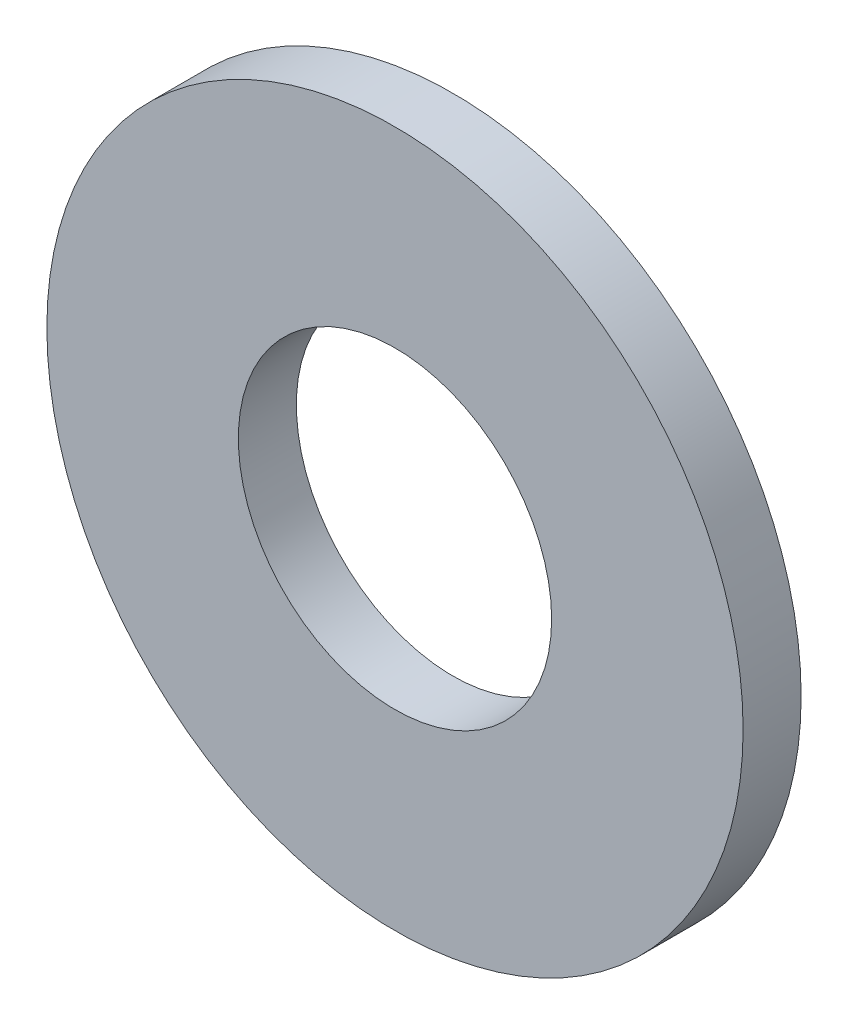
ISO-10303-21;
HEADER;
FILE_DESCRIPTION(('STEP AP214'),'2;1');
FILE_NAME('part.step','',(''),(''),'','','');
FILE_SCHEMA(('AUTOMOTIVE_DESIGN { 1 0 10303 214 1 1 1 1 }'));
ENDSEC;
DATA;
#1=APPLICATION_CONTEXT('core data for automotive mechanical design processes');
#2=APPLICATION_PROTOCOL_DEFINITION('international standard','automotive_design',2000,#1);
#3=PRODUCT_CONTEXT('',#1,'mechanical');
#4=PRODUCT('Part','Part','',(#3));
#5=PRODUCT_RELATED_PRODUCT_CATEGORY('part','',(#4));
#6=PRODUCT_DEFINITION_FORMATION('','',#4);
#7=PRODUCT_DEFINITION_CONTEXT('part definition',#1,'design');
#8=PRODUCT_DEFINITION('design','',#6,#7);
#9=PRODUCT_DEFINITION_SHAPE('','',#8);
#10=(LENGTH_UNIT() NAMED_UNIT(*) SI_UNIT(.MILLI.,.METRE.));
#11=(NAMED_UNIT(*) PLANE_ANGLE_UNIT() SI_UNIT($,.RADIAN.));
#12=(NAMED_UNIT(*) SI_UNIT($,.STERADIAN.) SOLID_ANGLE_UNIT());
#13=UNCERTAINTY_MEASURE_WITH_UNIT(LENGTH_MEASURE(1.E-05),#10,'distance_accuracy_value','');
#14=(GEOMETRIC_REPRESENTATION_CONTEXT(3) GLOBAL_UNCERTAINTY_ASSIGNED_CONTEXT((#13)) GLOBAL_UNIT_ASSIGNED_CONTEXT((#10,
#11,#12)) REPRESENTATION_CONTEXT('',''));
#15=CARTESIAN_POINT('',(0.,0.,0.));
#16=DIRECTION('',(0.,0.,1.));
#17=DIRECTION('',(1.,0.,0.));
#18=AXIS2_PLACEMENT_3D('',#15,#16,#17);
#19=CARTESIAN_POINT('',(0.,0.,-0.5));
#20=DIRECTION('',(0.,0.,1.));
#21=DIRECTION('',(1.,0.,0.));
#22=AXIS2_PLACEMENT_3D('',#19,#20,#21);
#23=CYLINDRICAL_SURFACE('',#22,3.);
#24=CARTESIAN_POINT('',(0.,0.,-0.5));
#25=DIRECTION('',(0.,0.,1.));
#26=DIRECTION('',(1.,0.,0.));
#27=AXIS2_PLACEMENT_3D('',#24,#25,#26);
#28=CIRCLE('',#27,3.);
#29=CARTESIAN_POINT('',(3.,0.,-0.5));
#30=VERTEX_POINT('',#29);
#31=EDGE_CURVE('E10',#30,#30,#28,.T.);
#32=ORIENTED_EDGE('',*,*,#31,.T.);
#33=EDGE_LOOP('',(#32));
#34=FACE_BOUND('',#33,.T.);
#35=CARTESIAN_POINT('',(0.,0.,0.));
#36=DIRECTION('',(0.,0.,1.));
#37=DIRECTION('',(1.,0.,0.));
#38=AXIS2_PLACEMENT_3D('',#35,#36,#37);
#39=CIRCLE('',#38,3.);
#40=CARTESIAN_POINT('',(3.,0.,0.));
#41=VERTEX_POINT('',#40);
#42=EDGE_CURVE('E31',#41,#41,#39,.T.);
#43=ORIENTED_EDGE('',*,*,#42,.F.);
#44=EDGE_LOOP('',(#43));
#45=FACE_BOUND('',#44,.T.);
#46=ADVANCED_FACE('F28',(#34,#45),#23,.T.);
#47=CARTESIAN_POINT('',(0.,0.,-0.5));
#48=DIRECTION('',(0.,0.,1.));
#49=DIRECTION('',(1.,0.,0.));
#50=AXIS2_PLACEMENT_3D('',#47,#48,#49);
#51=PLANE('',#50);
#52=CARTESIAN_POINT('',(0.,0.,-0.5));
#53=DIRECTION('',(0.,0.,1.));
#54=DIRECTION('',(1.,0.,0.));
#55=AXIS2_PLACEMENT_3D('',#52,#53,#54);
#56=CIRCLE('',#55,1.35);
#57=CARTESIAN_POINT('',(1.35,0.,-0.5));
#58=VERTEX_POINT('',#57);
#59=EDGE_CURVE('E38',#58,#58,#56,.T.);
#60=ORIENTED_EDGE('',*,*,#59,.T.);
#61=EDGE_LOOP('',(#60));
#62=FACE_BOUND('',#61,.T.);
#63=ORIENTED_EDGE('',*,*,#31,.F.);
#64=EDGE_LOOP('',(#63));
#65=FACE_BOUND('',#64,.T.);
#66=ADVANCED_FACE('F46',(#62,#65),#51,.F.);
#67=CARTESIAN_POINT('',(0.,0.,0.));
#68=DIRECTION('',(0.,0.,1.));
#69=DIRECTION('',(1.,0.,0.));
#70=AXIS2_PLACEMENT_3D('',#67,#68,#69);
#71=PLANE('',#70);
#72=CARTESIAN_POINT('',(0.,0.,0.));
#73=DIRECTION('',(0.,0.,1.));
#74=DIRECTION('',(1.,0.,0.));
#75=AXIS2_PLACEMENT_3D('',#72,#73,#74);
#76=CIRCLE('',#75,1.35);
#77=CARTESIAN_POINT('',(1.35,0.,0.));
#78=VERTEX_POINT('',#77);
#79=EDGE_CURVE('E40',#78,#78,#76,.T.);
#80=ORIENTED_EDGE('',*,*,#79,.F.);
#81=EDGE_LOOP('',(#80));
#82=FACE_BOUND('',#81,.T.);
#83=ORIENTED_EDGE('',*,*,#42,.T.);
#84=EDGE_LOOP('',(#83));
#85=FACE_BOUND('',#84,.T.);
#86=ADVANCED_FACE('F52',(#82,#85),#71,.T.);
#87=CARTESIAN_POINT('',(0.,0.,-0.5));
#88=DIRECTION('',(0.,0.,1.));
#89=DIRECTION('',(1.,0.,0.));
#90=AXIS2_PLACEMENT_3D('',#87,#88,#89);
#91=CYLINDRICAL_SURFACE('',#90,1.35);
#92=ORIENTED_EDGE('',*,*,#59,.F.);
#93=EDGE_LOOP('',(#92));
#94=FACE_BOUND('',#93,.T.);
#95=ORIENTED_EDGE('',*,*,#79,.T.);
#96=EDGE_LOOP('',(#95));
#97=FACE_BOUND('',#96,.T.);
#98=ADVANCED_FACE('F49',(#94,#97),#91,.F.);
#99=CLOSED_SHELL('',(#46,#66,#86,#98));
#100=MANIFOLD_SOLID_BREP('B2',#99);
#101=ADVANCED_BREP_SHAPE_REPRESENTATION('',(#18,#100),#14);
#102=SHAPE_DEFINITION_REPRESENTATION(#9,#101);
ENDSEC;
END-ISO-10303-21;
